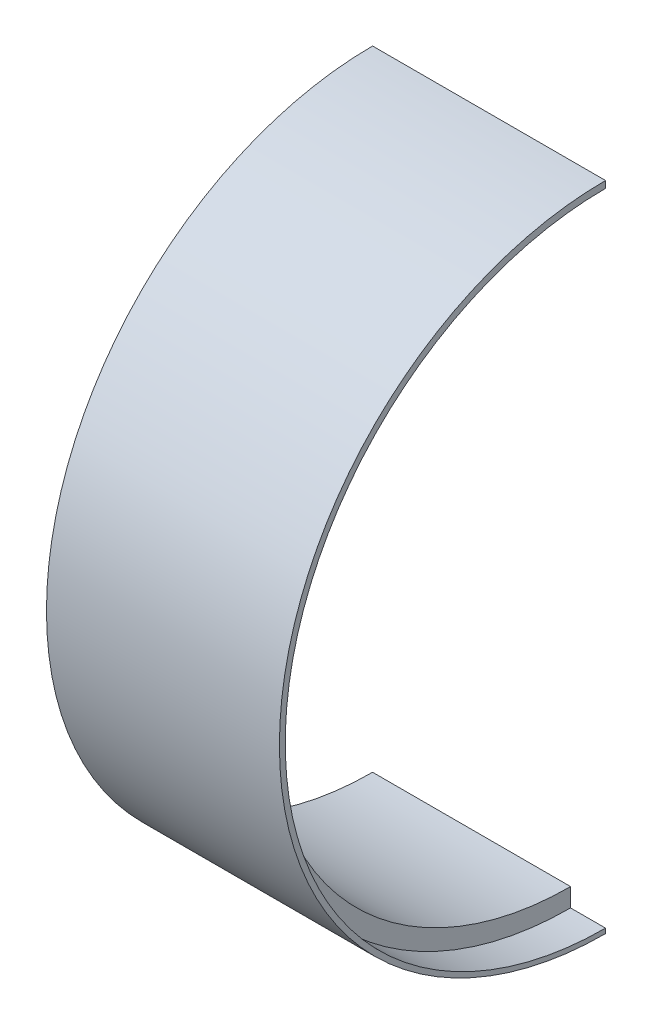
ISO-10303-21;
HEADER;
FILE_DESCRIPTION(('STEP AP214'),'2;1');
FILE_NAME('part.step','',(''),(''),'','','');
FILE_SCHEMA(('AUTOMOTIVE_DESIGN { 1 0 10303 214 1 1 1 1 }'));
ENDSEC;
DATA;
#1=APPLICATION_CONTEXT('core data for automotive mechanical design processes');
#2=APPLICATION_PROTOCOL_DEFINITION('international standard','automotive_design',2000,#1);
#3=PRODUCT_CONTEXT('',#1,'mechanical');
#4=PRODUCT('Part','Part','',(#3));
#5=PRODUCT_RELATED_PRODUCT_CATEGORY('part','',(#4));
#6=PRODUCT_DEFINITION_FORMATION('','',#4);
#7=PRODUCT_DEFINITION_CONTEXT('part definition',#1,'design');
#8=PRODUCT_DEFINITION('design','',#6,#7);
#9=PRODUCT_DEFINITION_SHAPE('','',#8);
#10=(LENGTH_UNIT() NAMED_UNIT(*) SI_UNIT(.MILLI.,.METRE.));
#11=(NAMED_UNIT(*) PLANE_ANGLE_UNIT() SI_UNIT($,.RADIAN.));
#12=(NAMED_UNIT(*) SI_UNIT($,.STERADIAN.) SOLID_ANGLE_UNIT());
#13=UNCERTAINTY_MEASURE_WITH_UNIT(LENGTH_MEASURE(1.E-05),#10,'distance_accuracy_value','');
#14=(GEOMETRIC_REPRESENTATION_CONTEXT(3) GLOBAL_UNCERTAINTY_ASSIGNED_CONTEXT((#13)) GLOBAL_UNIT_ASSIGNED_CONTEXT((#10,
#11,#12)) REPRESENTATION_CONTEXT('',''));
#15=CARTESIAN_POINT('',(0.,0.,0.));
#16=DIRECTION('',(0.,0.,1.));
#17=DIRECTION('',(1.,0.,0.));
#18=AXIS2_PLACEMENT_3D('',#15,#16,#17);
#19=CARTESIAN_POINT('',(508.,711.2,0.));
#20=DIRECTION('',(0.,0.,-1.));
#21=DIRECTION('',(-1.,0.,0.));
#22=AXIS2_PLACEMENT_3D('',#19,#20,#21);
#23=PLANE('',#22);
#24=DIRECTION('',(0.,-1.,0.));
#25=VECTOR('',#24,1.);
#26=CARTESIAN_POINT('',(508.,711.2,0.));
#27=LINE('',#26,#25);
#28=CARTESIAN_POINT('',(508.,711.2,0.));
#29=VERTEX_POINT('',#28);
#30=CARTESIAN_POINT('',(508.,696.250142702079,0.));
#31=VERTEX_POINT('',#30);
#32=EDGE_CURVE('E89',#29,#31,#27,.T.);
#33=ORIENTED_EDGE('',*,*,#32,.T.);
#34=DIRECTION('',(-1.,0.,0.));
#35=VECTOR('',#34,1.);
#36=CARTESIAN_POINT('',(508.,696.250142702079,2.05391259555654E-12));
#37=LINE('',#36,#35);
#38=CARTESIAN_POINT('',(431.8,696.250142702079,2.05391259555654E-12));
#39=VERTEX_POINT('',#38);
#40=EDGE_CURVE('E46',#31,#39,#37,.T.);
#41=ORIENTED_EDGE('',*,*,#40,.T.);
#42=DIRECTION('',(0.,1.,0.));
#43=VECTOR('',#42,1.);
#44=CARTESIAN_POINT('',(431.8,696.250142702079,2.05391259555654E-12));
#45=LINE('',#44,#43);
#46=CARTESIAN_POINT('',(431.8,660.4,2.05391259555654E-12));
#47=VERTEX_POINT('',#46);
#48=EDGE_CURVE('E119',#47,#39,#45,.T.);
#49=ORIENTED_EDGE('',*,*,#48,.F.);
#50=DIRECTION('',(-1.,0.,0.));
#51=VECTOR('',#50,1.);
#52=CARTESIAN_POINT('',(508.,660.4,0.));
#53=LINE('',#52,#51);
#54=CARTESIAN_POINT('',(0.,660.4,0.));
#55=VERTEX_POINT('',#54);
#56=EDGE_CURVE('E93',#47,#55,#53,.T.);
#57=ORIENTED_EDGE('',*,*,#56,.T.);
#58=DIRECTION('',(0.,-1.,0.));
#59=VECTOR('',#58,1.);
#60=CARTESIAN_POINT('',(0.,711.2,0.));
#61=LINE('',#60,#59);
#62=CARTESIAN_POINT('',(0.,711.2,0.));
#63=VERTEX_POINT('',#62);
#64=EDGE_CURVE('E86',#63,#55,#61,.T.);
#65=ORIENTED_EDGE('',*,*,#64,.F.);
#66=DIRECTION('',(-1.,0.,0.));
#67=VECTOR('',#66,1.);
#68=CARTESIAN_POINT('',(508.,711.2,0.));
#69=LINE('',#68,#67);
#70=EDGE_CURVE('E39',#29,#63,#69,.T.);
#71=ORIENTED_EDGE('',*,*,#70,.F.);
#72=EDGE_LOOP('',(#33,#41,#49,#57,#65,#71));
#73=FACE_BOUND('',#72,.T.);
#74=ADVANCED_FACE('F32',(#73),#23,.T.);
#75=CARTESIAN_POINT('',(508.,-660.4,0.));
#76=DIRECTION('',(0.,0.,-1.));
#77=DIRECTION('',(-1.,0.,0.));
#78=AXIS2_PLACEMENT_3D('',#75,#76,#77);
#79=PLANE('',#78);
#80=CARTESIAN_POINT('',(431.8,-700.749857297921,2.05391259555654E-12));
#81=VERTEX_POINT('',#80);
#82=CARTESIAN_POINT('',(431.8,-660.4,2.05391259555654E-12));
#83=VERTEX_POINT('',#82);
#84=EDGE_CURVE('E116',#81,#83,#45,.T.);
#85=ORIENTED_EDGE('',*,*,#84,.F.);
#86=DIRECTION('',(-1.,0.,0.));
#87=VECTOR('',#86,1.);
#88=CARTESIAN_POINT('',(508.,-700.749857297921,2.05391259555654E-12));
#89=LINE('',#88,#87);
#90=CARTESIAN_POINT('',(508.,-700.749857297921,2.05391259555654E-12));
#91=VERTEX_POINT('',#90);
#92=EDGE_CURVE('E96',#91,#81,#89,.T.);
#93=ORIENTED_EDGE('',*,*,#92,.F.);
#94=DIRECTION('',(0.,-1.,0.));
#95=VECTOR('',#94,1.);
#96=CARTESIAN_POINT('',(508.,-660.4,0.));
#97=LINE('',#96,#95);
#98=CARTESIAN_POINT('',(508.,-711.2,0.));
#99=VERTEX_POINT('',#98);
#100=EDGE_CURVE('E107',#91,#99,#97,.T.);
#101=ORIENTED_EDGE('',*,*,#100,.T.);
#102=DIRECTION('',(-1.,0.,0.));
#103=VECTOR('',#102,1.);
#104=CARTESIAN_POINT('',(508.,-711.2,0.));
#105=LINE('',#104,#103);
#106=CARTESIAN_POINT('',(0.,-711.2,0.));
#107=VERTEX_POINT('',#106);
#108=EDGE_CURVE('E80',#99,#107,#105,.T.);
#109=ORIENTED_EDGE('',*,*,#108,.T.);
#110=DIRECTION('',(0.,-1.,0.));
#111=VECTOR('',#110,1.);
#112=CARTESIAN_POINT('',(0.,-660.4,0.));
#113=LINE('',#112,#111);
#114=CARTESIAN_POINT('',(0.,-660.4,1.21313511923537E-13));
#115=VERTEX_POINT('',#114);
#116=EDGE_CURVE('E88',#115,#107,#113,.T.);
#117=ORIENTED_EDGE('',*,*,#116,.F.);
#118=DIRECTION('',(-1.,0.,0.));
#119=VECTOR('',#118,1.);
#120=CARTESIAN_POINT('',(508.,-660.4,1.21313511923537E-13));
#121=LINE('',#120,#119);
#122=EDGE_CURVE('E106',#83,#115,#121,.T.);
#123=ORIENTED_EDGE('',*,*,#122,.F.);
#124=EDGE_LOOP('',(#85,#93,#101,#109,#117,#123));
#125=FACE_BOUND('',#124,.T.);
#126=ADVANCED_FACE('F130',(#125),#79,.T.);
#127=CARTESIAN_POINT('',(508.,0.,0.));
#128=DIRECTION('',(-1.,0.,0.));
#129=DIRECTION('',(0.,0.,1.));
#130=AXIS2_PLACEMENT_3D('',#127,#128,#129);
#131=CYLINDRICAL_SURFACE('',#130,660.4);
#132=ORIENTED_EDGE('',*,*,#56,.F.);
#133=CARTESIAN_POINT('',(431.8,0.,0.));
#134=DIRECTION('',(1.,0.,0.));
#135=DIRECTION('',(0.,0.,-1.));
#136=AXIS2_PLACEMENT_3D('',#133,#134,#135);
#137=CIRCLE('',#136,660.4);
#138=EDGE_CURVE('E11',#47,#83,#137,.T.);
#139=ORIENTED_EDGE('',*,*,#138,.T.);
#140=ORIENTED_EDGE('',*,*,#122,.T.);
#141=CARTESIAN_POINT('',(0.,0.,0.));
#142=DIRECTION('',(1.,0.,0.));
#143=DIRECTION('',(0.,0.,-1.));
#144=AXIS2_PLACEMENT_3D('',#141,#142,#143);
#145=CIRCLE('',#144,660.4);
#146=EDGE_CURVE('E95',#55,#115,#145,.T.);
#147=ORIENTED_EDGE('',*,*,#146,.F.);
#148=EDGE_LOOP('',(#132,#139,#140,#147));
#149=FACE_BOUND('',#148,.T.);
#150=ADVANCED_FACE('F134',(#149),#131,.F.);
#151=CARTESIAN_POINT('',(508.,0.,0.));
#152=DIRECTION('',(1.,0.,0.));
#153=DIRECTION('',(0.,0.,-1.));
#154=AXIS2_PLACEMENT_3D('',#151,#152,#153);
#155=PLANE('',#154);
#156=ORIENTED_EDGE('',*,*,#100,.F.);
#157=CARTESIAN_POINT('',(508.,-2.24985729792073,2.05391259555654E-12));
#158=DIRECTION('',(1.,0.,0.));
#159=DIRECTION('',(0.,0.,-1.));
#160=AXIS2_PLACEMENT_3D('',#157,#158,#159);
#161=CIRCLE('',#160,698.5);
#162=EDGE_CURVE('E115',#31,#91,#161,.T.);
#163=ORIENTED_EDGE('',*,*,#162,.F.);
#164=ORIENTED_EDGE('',*,*,#32,.F.);
#165=CARTESIAN_POINT('',(508.,0.,0.));
#166=DIRECTION('',(1.,0.,0.));
#167=DIRECTION('',(0.,0.,-1.));
#168=AXIS2_PLACEMENT_3D('',#165,#166,#167);
#169=CIRCLE('',#168,711.2);
#170=EDGE_CURVE('E78',#29,#99,#169,.T.);
#171=ORIENTED_EDGE('',*,*,#170,.T.);
#172=EDGE_LOOP('',(#156,#163,#164,#171));
#173=FACE_BOUND('',#172,.T.);
#174=ADVANCED_FACE('F132',(#173),#155,.T.);
#175=CARTESIAN_POINT('',(508.,0.,0.));
#176=DIRECTION('',(-1.,0.,0.));
#177=DIRECTION('',(0.,0.,1.));
#178=AXIS2_PLACEMENT_3D('',#175,#176,#177);
#179=CYLINDRICAL_SURFACE('',#178,711.2);
#180=CARTESIAN_POINT('',(0.,0.,0.));
#181=DIRECTION('',(1.,0.,0.));
#182=DIRECTION('',(0.,0.,-1.));
#183=AXIS2_PLACEMENT_3D('',#180,#181,#182);
#184=CIRCLE('',#183,711.2);
#185=EDGE_CURVE('E75',#63,#107,#184,.T.);
#186=ORIENTED_EDGE('',*,*,#185,.T.);
#187=ORIENTED_EDGE('',*,*,#108,.F.);
#188=ORIENTED_EDGE('',*,*,#170,.F.);
#189=ORIENTED_EDGE('',*,*,#70,.T.);
#190=EDGE_LOOP('',(#186,#187,#188,#189));
#191=FACE_BOUND('',#190,.T.);
#192=ADVANCED_FACE('F73',(#191),#179,.T.);
#193=CARTESIAN_POINT('',(0.,0.,0.));
#194=DIRECTION('',(1.,0.,0.));
#195=DIRECTION('',(0.,0.,-1.));
#196=AXIS2_PLACEMENT_3D('',#193,#194,#195);
#197=PLANE('',#196);
#198=ORIENTED_EDGE('',*,*,#64,.T.);
#199=ORIENTED_EDGE('',*,*,#146,.T.);
#200=ORIENTED_EDGE('',*,*,#116,.T.);
#201=ORIENTED_EDGE('',*,*,#185,.F.);
#202=EDGE_LOOP('',(#198,#199,#200,#201));
#203=FACE_BOUND('',#202,.T.);
#204=ADVANCED_FACE('F84',(#203),#197,.F.);
#205=CARTESIAN_POINT('',(508.,-2.24985729792073,2.05391259555654E-12));
#206=DIRECTION('',(-1.,0.,0.));
#207=DIRECTION('',(0.,0.,1.));
#208=AXIS2_PLACEMENT_3D('',#205,#206,#207);
#209=CYLINDRICAL_SURFACE('',#208,698.5);
#210=CARTESIAN_POINT('',(431.8,-2.24985729792073,2.05391259555654E-12));
#211=DIRECTION('',(1.,0.,0.));
#212=DIRECTION('',(0.,0.,-1.));
#213=AXIS2_PLACEMENT_3D('',#210,#211,#212);
#214=CIRCLE('',#213,698.5);
#215=EDGE_CURVE('E120',#39,#81,#214,.T.);
#216=ORIENTED_EDGE('',*,*,#215,.F.);
#217=ORIENTED_EDGE('',*,*,#40,.F.);
#218=ORIENTED_EDGE('',*,*,#162,.T.);
#219=ORIENTED_EDGE('',*,*,#92,.T.);
#220=EDGE_LOOP('',(#216,#217,#218,#219));
#221=FACE_BOUND('',#220,.T.);
#222=ADVANCED_FACE('F124',(#221),#209,.F.);
#223=CARTESIAN_POINT('',(431.8,-2.24985729792073,2.05391259555654E-12));
#224=DIRECTION('',(1.,0.,0.));
#225=DIRECTION('',(0.,0.,-1.));
#226=AXIS2_PLACEMENT_3D('',#223,#224,#225);
#227=PLANE('',#226);
#228=ORIENTED_EDGE('',*,*,#48,.T.);
#229=ORIENTED_EDGE('',*,*,#215,.T.);
#230=ORIENTED_EDGE('',*,*,#84,.T.);
#231=ORIENTED_EDGE('',*,*,#138,.F.);
#232=EDGE_LOOP('',(#228,#229,#230,#231));
#233=FACE_BOUND('',#232,.T.);
#234=ADVANCED_FACE('F157',(#233),#227,.T.);
#235=CLOSED_SHELL('',(#74,#126,#150,#174,#192,#204,#222,#234));
#236=MANIFOLD_SOLID_BREP('B2',#235);
#237=ADVANCED_BREP_SHAPE_REPRESENTATION('',(#18,#236),#14);
#238=SHAPE_DEFINITION_REPRESENTATION(#9,#237);
ENDSEC;
END-ISO-10303-21;
